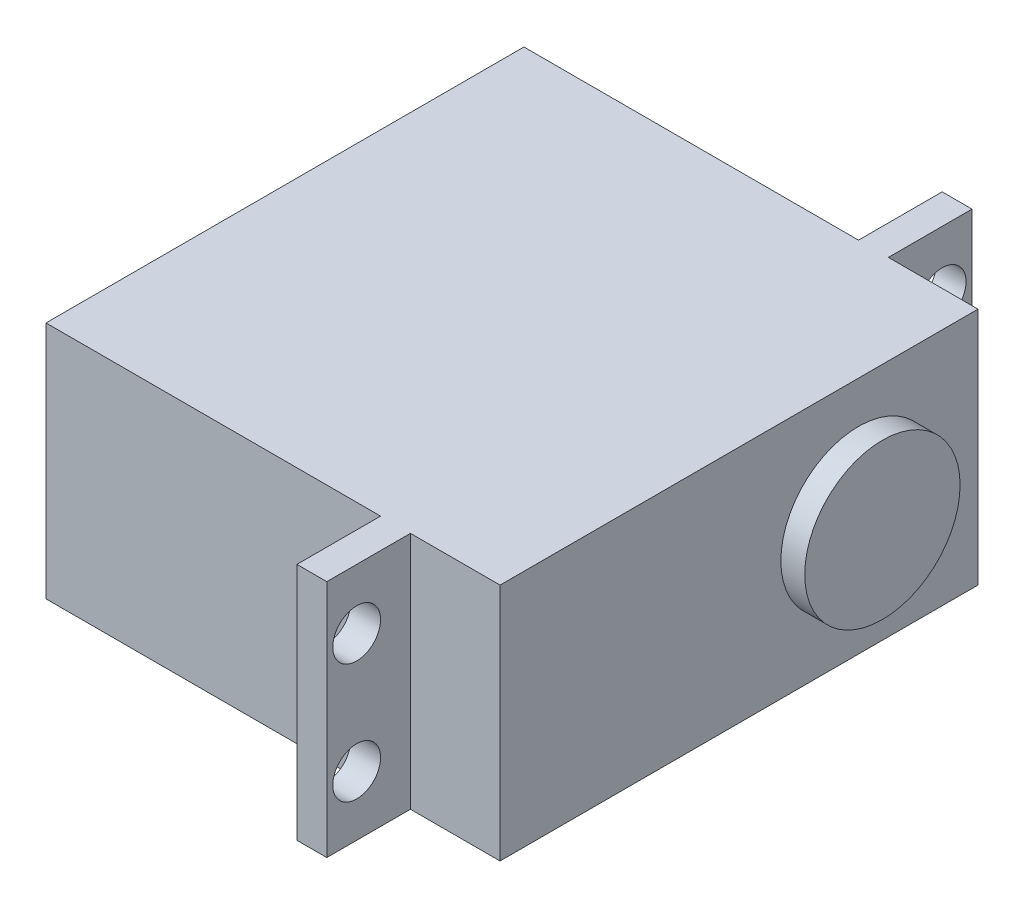
ISO-10303-21;
HEADER;
FILE_DESCRIPTION(('STEP AP214'),'2;1');
FILE_NAME('part.step','',(''),(''),'','','');
FILE_SCHEMA(('AUTOMOTIVE_DESIGN { 1 0 10303 214 1 1 1 1 }'));
ENDSEC;
DATA;
#1=APPLICATION_CONTEXT('core data for automotive mechanical design processes');
#2=APPLICATION_PROTOCOL_DEFINITION('international standard','automotive_design',2000,#1);
#3=PRODUCT_CONTEXT('',#1,'mechanical');
#4=PRODUCT('Part','Part','',(#3));
#5=PRODUCT_RELATED_PRODUCT_CATEGORY('part','',(#4));
#6=PRODUCT_DEFINITION_FORMATION('','',#4);
#7=PRODUCT_DEFINITION_CONTEXT('part definition',#1,'design');
#8=PRODUCT_DEFINITION('design','',#6,#7);
#9=PRODUCT_DEFINITION_SHAPE('','',#8);
#10=(LENGTH_UNIT() NAMED_UNIT(*) SI_UNIT(.MILLI.,.METRE.));
#11=(NAMED_UNIT(*) PLANE_ANGLE_UNIT() SI_UNIT($,.RADIAN.));
#12=(NAMED_UNIT(*) SI_UNIT($,.STERADIAN.) SOLID_ANGLE_UNIT());
#13=UNCERTAINTY_MEASURE_WITH_UNIT(LENGTH_MEASURE(1.E-05),#10,'distance_accuracy_value','');
#14=(GEOMETRIC_REPRESENTATION_CONTEXT(3) GLOBAL_UNCERTAINTY_ASSIGNED_CONTEXT((#13)) GLOBAL_UNIT_ASSIGNED_CONTEXT((#10,
#11,#12)) REPRESENTATION_CONTEXT('',''));
#15=CARTESIAN_POINT('',(0.,0.,0.));
#16=DIRECTION('',(0.,0.,1.));
#17=DIRECTION('',(1.,0.,0.));
#18=AXIS2_PLACEMENT_3D('',#15,#16,#17);
#19=CARTESIAN_POINT('',(19.,20.,-20.));
#20=DIRECTION('',(-1.,0.,0.));
#21=DIRECTION('',(0.,0.,1.));
#22=AXIS2_PLACEMENT_3D('',#19,#20,#21);
#23=PLANE('',#22);
#24=DIRECTION('',(0.,0.,-1.));
#25=VECTOR('',#24,1.);
#26=CARTESIAN_POINT('',(19.,0.,-20.));
#27=LINE('',#26,#25);
#28=CARTESIAN_POINT('',(19.,0.,20.));
#29=VERTEX_POINT('',#28);
#30=CARTESIAN_POINT('',(19.,0.,-20.));
#31=VERTEX_POINT('',#30);
#32=EDGE_CURVE('E158',#29,#31,#27,.T.);
#33=ORIENTED_EDGE('',*,*,#32,.T.);
#34=DIRECTION('',(0.,-1.,0.));
#35=VECTOR('',#34,1.);
#36=CARTESIAN_POINT('',(19.,20.,-20.));
#37=LINE('',#36,#35);
#38=CARTESIAN_POINT('',(19.,20.,-20.));
#39=VERTEX_POINT('',#38);
#40=EDGE_CURVE('E200',#39,#31,#37,.T.);
#41=ORIENTED_EDGE('',*,*,#40,.F.);
#42=DIRECTION('',(0.,0.,-1.));
#43=VECTOR('',#42,1.);
#44=CARTESIAN_POINT('',(19.,20.,-20.));
#45=LINE('',#44,#43);
#46=CARTESIAN_POINT('',(19.,20.,20.));
#47=VERTEX_POINT('',#46);
#48=EDGE_CURVE('E106',#47,#39,#45,.T.);
#49=ORIENTED_EDGE('',*,*,#48,.F.);
#50=DIRECTION('',(0.,-1.,0.));
#51=VECTOR('',#50,1.);
#52=CARTESIAN_POINT('',(19.,20.,20.));
#53=LINE('',#52,#51);
#54=EDGE_CURVE('E42',#47,#29,#53,.T.);
#55=ORIENTED_EDGE('',*,*,#54,.T.);
#56=EDGE_LOOP('',(#33,#41,#49,#55));
#57=FACE_BOUND('',#56,.T.);
#58=CARTESIAN_POINT('',(19.,10.,-10.));
#59=DIRECTION('',(-1.,0.,0.));
#60=DIRECTION('',(0.,0.,1.));
#61=AXIS2_PLACEMENT_3D('',#58,#59,#60);
#62=CIRCLE('',#61,6.5);
#63=CARTESIAN_POINT('',(19.,10.,-3.5));
#64=VERTEX_POINT('',#63);
#65=EDGE_CURVE('E11',#64,#64,#62,.F.);
#66=ORIENTED_EDGE('',*,*,#65,.F.);
#67=EDGE_LOOP('',(#66));
#68=FACE_BOUND('',#67,.T.);
#69=ADVANCED_FACE('F33',(#57,#68),#23,.F.);
#70=CARTESIAN_POINT('',(11.5,20.,20.));
#71=DIRECTION('',(0.,0.,-1.));
#72=DIRECTION('',(-1.,0.,0.));
#73=AXIS2_PLACEMENT_3D('',#70,#71,#72);
#74=PLANE('',#73);
#75=DIRECTION('',(1.,0.,0.));
#76=VECTOR('',#75,1.);
#77=CARTESIAN_POINT('',(11.5,0.,20.));
#78=LINE('',#77,#76);
#79=CARTESIAN_POINT('',(11.5,0.,20.));
#80=VERTEX_POINT('',#79);
#81=EDGE_CURVE('E155',#80,#29,#78,.T.);
#82=ORIENTED_EDGE('',*,*,#81,.T.);
#83=ORIENTED_EDGE('',*,*,#54,.F.);
#84=DIRECTION('',(1.,0.,0.));
#85=VECTOR('',#84,1.);
#86=CARTESIAN_POINT('',(11.5,20.,20.));
#87=LINE('',#86,#85);
#88=CARTESIAN_POINT('',(11.5,20.,20.));
#89=VERTEX_POINT('',#88);
#90=EDGE_CURVE('E178',#89,#47,#87,.T.);
#91=ORIENTED_EDGE('',*,*,#90,.F.);
#92=DIRECTION('',(0.,-1.,0.));
#93=VECTOR('',#92,1.);
#94=CARTESIAN_POINT('',(11.5,20.,20.));
#95=LINE('',#94,#93);
#96=EDGE_CURVE('E151',#89,#80,#95,.T.);
#97=ORIENTED_EDGE('',*,*,#96,.T.);
#98=EDGE_LOOP('',(#82,#83,#91,#97));
#99=FACE_BOUND('',#98,.T.);
#100=ADVANCED_FACE('F35',(#99),#74,.F.);
#101=CARTESIAN_POINT('',(11.5,20.,-20.));
#102=DIRECTION('',(0.,0.,1.));
#103=DIRECTION('',(1.,0.,0.));
#104=AXIS2_PLACEMENT_3D('',#101,#102,#103);
#105=PLANE('',#104);
#106=DIRECTION('',(-1.,0.,0.));
#107=VECTOR('',#106,1.);
#108=CARTESIAN_POINT('',(11.5,0.,-20.));
#109=LINE('',#108,#107);
#110=CARTESIAN_POINT('',(11.5,0.,-20.));
#111=VERTEX_POINT('',#110);
#112=EDGE_CURVE('E161',#31,#111,#109,.T.);
#113=ORIENTED_EDGE('',*,*,#112,.T.);
#114=DIRECTION('',(0.,-1.,0.));
#115=VECTOR('',#114,1.);
#116=CARTESIAN_POINT('',(11.5,20.,-20.));
#117=LINE('',#116,#115);
#118=CARTESIAN_POINT('',(11.5,20.,-20.));
#119=VERTEX_POINT('',#118);
#120=EDGE_CURVE('E197',#119,#111,#117,.T.);
#121=ORIENTED_EDGE('',*,*,#120,.F.);
#122=DIRECTION('',(-1.,0.,0.));
#123=VECTOR('',#122,1.);
#124=CARTESIAN_POINT('',(11.5,20.,-20.));
#125=LINE('',#124,#123);
#126=EDGE_CURVE('E223',#39,#119,#125,.T.);
#127=ORIENTED_EDGE('',*,*,#126,.F.);
#128=ORIENTED_EDGE('',*,*,#40,.T.);
#129=EDGE_LOOP('',(#113,#121,#127,#128));
#130=FACE_BOUND('',#129,.T.);
#131=ADVANCED_FACE('F214',(#130),#105,.F.);
#132=CARTESIAN_POINT('',(11.5,20.,-27.));
#133=DIRECTION('',(-1.,0.,0.));
#134=DIRECTION('',(0.,0.,1.));
#135=AXIS2_PLACEMENT_3D('',#132,#133,#134);
#136=PLANE('',#135);
#137=CARTESIAN_POINT('',(11.5,15.,-24.5));
#138=DIRECTION('',(1.,0.,0.));
#139=DIRECTION('',(0.,0.,-1.));
#140=AXIS2_PLACEMENT_3D('',#137,#138,#139);
#141=CIRCLE('',#140,2.00000000000001);
#142=CARTESIAN_POINT('',(11.5,15.,-26.5));
#143=VERTEX_POINT('',#142);
#144=EDGE_CURVE('E427',#143,#143,#141,.T.);
#145=ORIENTED_EDGE('',*,*,#144,.F.);
#146=EDGE_LOOP('',(#145));
#147=FACE_BOUND('',#146,.T.);
#148=CARTESIAN_POINT('',(11.5,5.,-24.5));
#149=DIRECTION('',(1.,0.,0.));
#150=DIRECTION('',(0.,0.,-1.));
#151=AXIS2_PLACEMENT_3D('',#148,#149,#150);
#152=CIRCLE('',#151,2.);
#153=CARTESIAN_POINT('',(11.5,5.,-26.5));
#154=VERTEX_POINT('',#153);
#155=EDGE_CURVE('E435',#154,#154,#152,.T.);
#156=ORIENTED_EDGE('',*,*,#155,.F.);
#157=EDGE_LOOP('',(#156));
#158=FACE_BOUND('',#157,.T.);
#159=DIRECTION('',(0.,0.,-1.));
#160=VECTOR('',#159,1.);
#161=CARTESIAN_POINT('',(11.5,0.,-27.));
#162=LINE('',#161,#160);
#163=CARTESIAN_POINT('',(11.5,0.,-27.));
#164=VERTEX_POINT('',#163);
#165=EDGE_CURVE('E163',#111,#164,#162,.T.);
#166=ORIENTED_EDGE('',*,*,#165,.T.);
#167=DIRECTION('',(0.,-1.,0.));
#168=VECTOR('',#167,1.);
#169=CARTESIAN_POINT('',(11.5,20.,-27.));
#170=LINE('',#169,#168);
#171=CARTESIAN_POINT('',(11.5,20.,-27.));
#172=VERTEX_POINT('',#171);
#173=EDGE_CURVE('E194',#172,#164,#170,.T.);
#174=ORIENTED_EDGE('',*,*,#173,.F.);
#175=DIRECTION('',(0.,0.,-1.));
#176=VECTOR('',#175,1.);
#177=CARTESIAN_POINT('',(11.5,20.,-27.));
#178=LINE('',#177,#176);
#179=EDGE_CURVE('E220',#119,#172,#178,.T.);
#180=ORIENTED_EDGE('',*,*,#179,.F.);
#181=ORIENTED_EDGE('',*,*,#120,.T.);
#182=EDGE_LOOP('',(#166,#174,#180,#181));
#183=FACE_BOUND('',#182,.T.);
#184=ADVANCED_FACE('F218',(#147,#158,#183),#136,.F.);
#185=CARTESIAN_POINT('',(9.,20.,-27.));
#186=DIRECTION('',(0.,0.,1.));
#187=DIRECTION('',(1.,0.,0.));
#188=AXIS2_PLACEMENT_3D('',#185,#186,#187);
#189=PLANE('',#188);
#190=DIRECTION('',(-1.,0.,0.));
#191=VECTOR('',#190,1.);
#192=CARTESIAN_POINT('',(9.,0.,-27.));
#193=LINE('',#192,#191);
#194=CARTESIAN_POINT('',(9.,0.,-27.));
#195=VERTEX_POINT('',#194);
#196=EDGE_CURVE('E165',#164,#195,#193,.T.);
#197=ORIENTED_EDGE('',*,*,#196,.T.);
#198=DIRECTION('',(0.,-1.,0.));
#199=VECTOR('',#198,1.);
#200=CARTESIAN_POINT('',(9.,20.,-27.));
#201=LINE('',#200,#199);
#202=CARTESIAN_POINT('',(9.,20.,-27.));
#203=VERTEX_POINT('',#202);
#204=EDGE_CURVE('E191',#203,#195,#201,.T.);
#205=ORIENTED_EDGE('',*,*,#204,.F.);
#206=DIRECTION('',(-1.,0.,0.));
#207=VECTOR('',#206,1.);
#208=CARTESIAN_POINT('',(9.,20.,-27.));
#209=LINE('',#208,#207);
#210=EDGE_CURVE('E222',#172,#203,#209,.T.);
#211=ORIENTED_EDGE('',*,*,#210,.F.);
#212=ORIENTED_EDGE('',*,*,#173,.T.);
#213=EDGE_LOOP('',(#197,#205,#211,#212));
#214=FACE_BOUND('',#213,.T.);
#215=ADVANCED_FACE('F254',(#214),#189,.F.);
#216=CARTESIAN_POINT('',(9.,20.,-27.));
#217=DIRECTION('',(1.,0.,0.));
#218=DIRECTION('',(0.,0.,-1.));
#219=AXIS2_PLACEMENT_3D('',#216,#217,#218);
#220=PLANE('',#219);
#221=CARTESIAN_POINT('',(9.00000000000001,15.,-24.5));
#222=DIRECTION('',(1.,0.,0.));
#223=DIRECTION('',(0.,0.,-1.));
#224=AXIS2_PLACEMENT_3D('',#221,#222,#223);
#225=CIRCLE('',#224,2.00000000000001);
#226=CARTESIAN_POINT('',(9.00000000000001,15.,-26.5));
#227=VERTEX_POINT('',#226);
#228=EDGE_CURVE('E430',#227,#227,#225,.F.);
#229=ORIENTED_EDGE('',*,*,#228,.F.);
#230=EDGE_LOOP('',(#229));
#231=FACE_BOUND('',#230,.T.);
#232=CARTESIAN_POINT('',(9.00000000000001,5.,-24.5));
#233=DIRECTION('',(1.,0.,0.));
#234=DIRECTION('',(0.,0.,-1.));
#235=AXIS2_PLACEMENT_3D('',#232,#233,#234);
#236=CIRCLE('',#235,2.);
#237=CARTESIAN_POINT('',(9.00000000000001,5.,-26.5));
#238=VERTEX_POINT('',#237);
#239=EDGE_CURVE('E438',#238,#238,#236,.F.);
#240=ORIENTED_EDGE('',*,*,#239,.F.);
#241=EDGE_LOOP('',(#240));
#242=FACE_BOUND('',#241,.T.);
#243=DIRECTION('',(0.,0.,1.));
#244=VECTOR('',#243,1.);
#245=CARTESIAN_POINT('',(9.,0.,-27.));
#246=LINE('',#245,#244);
#247=CARTESIAN_POINT('',(9.,0.,-20.));
#248=VERTEX_POINT('',#247);
#249=EDGE_CURVE('E167',#195,#248,#246,.T.);
#250=ORIENTED_EDGE('',*,*,#249,.T.);
#251=DIRECTION('',(0.,-1.,0.));
#252=VECTOR('',#251,1.);
#253=CARTESIAN_POINT('',(9.,20.,-20.));
#254=LINE('',#253,#252);
#255=CARTESIAN_POINT('',(9.,20.,-20.));
#256=VERTEX_POINT('',#255);
#257=EDGE_CURVE('E188',#256,#248,#254,.T.);
#258=ORIENTED_EDGE('',*,*,#257,.F.);
#259=DIRECTION('',(0.,0.,1.));
#260=VECTOR('',#259,1.);
#261=CARTESIAN_POINT('',(9.,20.,-27.));
#262=LINE('',#261,#260);
#263=EDGE_CURVE('E225',#203,#256,#262,.T.);
#264=ORIENTED_EDGE('',*,*,#263,.F.);
#265=ORIENTED_EDGE('',*,*,#204,.T.);
#266=EDGE_LOOP('',(#250,#258,#264,#265));
#267=FACE_BOUND('',#266,.T.);
#268=ADVANCED_FACE('F251',(#231,#242,#267),#220,.F.);
#269=CARTESIAN_POINT('',(-19.,20.,-20.));
#270=DIRECTION('',(0.,0.,1.));
#271=DIRECTION('',(1.,0.,0.));
#272=AXIS2_PLACEMENT_3D('',#269,#270,#271);
#273=PLANE('',#272);
#274=DIRECTION('',(-1.,0.,0.));
#275=VECTOR('',#274,1.);
#276=CARTESIAN_POINT('',(-19.,0.,-20.));
#277=LINE('',#276,#275);
#278=CARTESIAN_POINT('',(-19.,0.,-20.));
#279=VERTEX_POINT('',#278);
#280=EDGE_CURVE('E169',#248,#279,#277,.T.);
#281=ORIENTED_EDGE('',*,*,#280,.T.);
#282=DIRECTION('',(0.,-1.,0.));
#283=VECTOR('',#282,1.);
#284=CARTESIAN_POINT('',(-19.,20.,-20.));
#285=LINE('',#284,#283);
#286=CARTESIAN_POINT('',(-19.,20.,-20.));
#287=VERTEX_POINT('',#286);
#288=EDGE_CURVE('E185',#287,#279,#285,.T.);
#289=ORIENTED_EDGE('',*,*,#288,.F.);
#290=DIRECTION('',(-1.,0.,0.));
#291=VECTOR('',#290,1.);
#292=CARTESIAN_POINT('',(-19.,20.,-20.));
#293=LINE('',#292,#291);
#294=EDGE_CURVE('E231',#256,#287,#293,.T.);
#295=ORIENTED_EDGE('',*,*,#294,.F.);
#296=ORIENTED_EDGE('',*,*,#257,.T.);
#297=EDGE_LOOP('',(#281,#289,#295,#296));
#298=FACE_BOUND('',#297,.T.);
#299=ADVANCED_FACE('F247',(#298),#273,.F.);
#300=CARTESIAN_POINT('',(-19.,20.,-20.));
#301=DIRECTION('',(1.,0.,0.));
#302=DIRECTION('',(0.,0.,-1.));
#303=AXIS2_PLACEMENT_3D('',#300,#301,#302);
#304=PLANE('',#303);
#305=DIRECTION('',(0.,0.,1.));
#306=VECTOR('',#305,1.);
#307=CARTESIAN_POINT('',(-19.,0.,-20.));
#308=LINE('',#307,#306);
#309=CARTESIAN_POINT('',(-19.,0.,20.));
#310=VERTEX_POINT('',#309);
#311=EDGE_CURVE('E171',#279,#310,#308,.T.);
#312=ORIENTED_EDGE('',*,*,#311,.T.);
#313=DIRECTION('',(0.,-1.,0.));
#314=VECTOR('',#313,1.);
#315=CARTESIAN_POINT('',(-19.,20.,20.));
#316=LINE('',#315,#314);
#317=CARTESIAN_POINT('',(-19.,20.,20.));
#318=VERTEX_POINT('',#317);
#319=EDGE_CURVE('E182',#318,#310,#316,.T.);
#320=ORIENTED_EDGE('',*,*,#319,.F.);
#321=DIRECTION('',(0.,0.,1.));
#322=VECTOR('',#321,1.);
#323=CARTESIAN_POINT('',(-19.,20.,-20.));
#324=LINE('',#323,#322);
#325=EDGE_CURVE('E233',#287,#318,#324,.T.);
#326=ORIENTED_EDGE('',*,*,#325,.F.);
#327=ORIENTED_EDGE('',*,*,#288,.T.);
#328=EDGE_LOOP('',(#312,#320,#326,#327));
#329=FACE_BOUND('',#328,.T.);
#330=ADVANCED_FACE('F239',(#329),#304,.F.);
#331=CARTESIAN_POINT('',(-19.,20.,20.));
#332=DIRECTION('',(0.,0.,-1.));
#333=DIRECTION('',(-1.,0.,0.));
#334=AXIS2_PLACEMENT_3D('',#331,#332,#333);
#335=PLANE('',#334);
#336=DIRECTION('',(1.,0.,0.));
#337=VECTOR('',#336,1.);
#338=CARTESIAN_POINT('',(-19.,0.,20.));
#339=LINE('',#338,#337);
#340=CARTESIAN_POINT('',(9.00000000000001,0.,20.));
#341=VERTEX_POINT('',#340);
#342=EDGE_CURVE('E173',#310,#341,#339,.T.);
#343=ORIENTED_EDGE('',*,*,#342,.T.);
#344=DIRECTION('',(0.,-1.,0.));
#345=VECTOR('',#344,1.);
#346=CARTESIAN_POINT('',(9.00000000000001,20.,20.));
#347=LINE('',#346,#345);
#348=CARTESIAN_POINT('',(9.00000000000001,20.,20.));
#349=VERTEX_POINT('',#348);
#350=EDGE_CURVE('E146',#349,#341,#347,.T.);
#351=ORIENTED_EDGE('',*,*,#350,.F.);
#352=DIRECTION('',(1.,0.,0.));
#353=VECTOR('',#352,1.);
#354=CARTESIAN_POINT('',(-19.,20.,20.));
#355=LINE('',#354,#353);
#356=EDGE_CURVE('E137',#318,#349,#355,.T.);
#357=ORIENTED_EDGE('',*,*,#356,.F.);
#358=ORIENTED_EDGE('',*,*,#319,.T.);
#359=EDGE_LOOP('',(#343,#351,#357,#358));
#360=FACE_BOUND('',#359,.T.);
#361=ADVANCED_FACE('F243',(#360),#335,.F.);
#362=CARTESIAN_POINT('',(9.00000000000001,20.,27.));
#363=DIRECTION('',(1.,0.,0.));
#364=DIRECTION('',(0.,0.,-1.));
#365=AXIS2_PLACEMENT_3D('',#362,#363,#364);
#366=PLANE('',#365);
#367=CARTESIAN_POINT('',(9.00000000000001,5.,24.5));
#368=DIRECTION('',(1.,0.,0.));
#369=DIRECTION('',(0.,0.,-1.));
#370=AXIS2_PLACEMENT_3D('',#367,#368,#369);
#371=CIRCLE('',#370,2.);
#372=CARTESIAN_POINT('',(9.00000000000001,5.,22.5));
#373=VERTEX_POINT('',#372);
#374=EDGE_CURVE('E444',#373,#373,#371,.F.);
#375=ORIENTED_EDGE('',*,*,#374,.F.);
#376=EDGE_LOOP('',(#375));
#377=FACE_BOUND('',#376,.T.);
#378=CARTESIAN_POINT('',(9.00000000000001,15.,24.5));
#379=DIRECTION('',(1.,0.,0.));
#380=DIRECTION('',(0.,0.,-1.));
#381=AXIS2_PLACEMENT_3D('',#378,#379,#380);
#382=CIRCLE('',#381,2.00000000000001);
#383=CARTESIAN_POINT('',(9.00000000000001,15.,22.5));
#384=VERTEX_POINT('',#383);
#385=EDGE_CURVE('E159',#384,#384,#382,.F.);
#386=ORIENTED_EDGE('',*,*,#385,.F.);
#387=EDGE_LOOP('',(#386));
#388=FACE_BOUND('',#387,.T.);
#389=DIRECTION('',(0.,0.,1.));
#390=VECTOR('',#389,1.);
#391=CARTESIAN_POINT('',(9.00000000000001,0.,27.));
#392=LINE('',#391,#390);
#393=CARTESIAN_POINT('',(9.00000000000001,0.,27.));
#394=VERTEX_POINT('',#393);
#395=EDGE_CURVE('E145',#341,#394,#392,.T.);
#396=ORIENTED_EDGE('',*,*,#395,.T.);
#397=DIRECTION('',(0.,-1.,0.));
#398=VECTOR('',#397,1.);
#399=CARTESIAN_POINT('',(9.00000000000001,20.,27.));
#400=LINE('',#399,#398);
#401=CARTESIAN_POINT('',(9.00000000000001,20.,27.));
#402=VERTEX_POINT('',#401);
#403=EDGE_CURVE('E142',#402,#394,#400,.T.);
#404=ORIENTED_EDGE('',*,*,#403,.F.);
#405=DIRECTION('',(0.,0.,1.));
#406=VECTOR('',#405,1.);
#407=CARTESIAN_POINT('',(9.00000000000001,20.,27.));
#408=LINE('',#407,#406);
#409=EDGE_CURVE('E131',#349,#402,#408,.T.);
#410=ORIENTED_EDGE('',*,*,#409,.F.);
#411=ORIENTED_EDGE('',*,*,#350,.T.);
#412=EDGE_LOOP('',(#396,#404,#410,#411));
#413=FACE_BOUND('',#412,.T.);
#414=ADVANCED_FACE('F143',(#377,#388,#413),#366,.F.);
#415=CARTESIAN_POINT('',(9.00000000000001,20.,27.));
#416=DIRECTION('',(0.,0.,-1.));
#417=DIRECTION('',(-1.,0.,0.));
#418=AXIS2_PLACEMENT_3D('',#415,#416,#417);
#419=PLANE('',#418);
#420=DIRECTION('',(1.,0.,0.));
#421=VECTOR('',#420,1.);
#422=CARTESIAN_POINT('',(9.00000000000001,0.,27.));
#423=LINE('',#422,#421);
#424=CARTESIAN_POINT('',(11.5,0.,27.));
#425=VERTEX_POINT('',#424);
#426=EDGE_CURVE('E91',#394,#425,#423,.T.);
#427=ORIENTED_EDGE('',*,*,#426,.T.);
#428=DIRECTION('',(0.,-1.,0.));
#429=VECTOR('',#428,1.);
#430=CARTESIAN_POINT('',(11.5,20.,27.));
#431=LINE('',#430,#429);
#432=CARTESIAN_POINT('',(11.5,20.,27.));
#433=VERTEX_POINT('',#432);
#434=EDGE_CURVE('E147',#433,#425,#431,.T.);
#435=ORIENTED_EDGE('',*,*,#434,.F.);
#436=DIRECTION('',(1.,0.,0.));
#437=VECTOR('',#436,1.);
#438=CARTESIAN_POINT('',(9.00000000000001,20.,27.));
#439=LINE('',#438,#437);
#440=EDGE_CURVE('E135',#402,#433,#439,.T.);
#441=ORIENTED_EDGE('',*,*,#440,.F.);
#442=ORIENTED_EDGE('',*,*,#403,.T.);
#443=EDGE_LOOP('',(#427,#435,#441,#442));
#444=FACE_BOUND('',#443,.T.);
#445=ADVANCED_FACE('F149',(#444),#419,.F.);
#446=CARTESIAN_POINT('',(11.5,20.,27.));
#447=DIRECTION('',(-1.,0.,0.));
#448=DIRECTION('',(0.,0.,1.));
#449=AXIS2_PLACEMENT_3D('',#446,#447,#448);
#450=PLANE('',#449);
#451=CARTESIAN_POINT('',(11.5,5.,24.5));
#452=DIRECTION('',(1.,0.,0.));
#453=DIRECTION('',(0.,0.,-1.));
#454=AXIS2_PLACEMENT_3D('',#451,#452,#453);
#455=CIRCLE('',#454,2.);
#456=CARTESIAN_POINT('',(11.5,5.,22.5));
#457=VERTEX_POINT('',#456);
#458=EDGE_CURVE('E441',#457,#457,#455,.T.);
#459=ORIENTED_EDGE('',*,*,#458,.F.);
#460=EDGE_LOOP('',(#459));
#461=FACE_BOUND('',#460,.T.);
#462=CARTESIAN_POINT('',(11.5,15.,24.5));
#463=DIRECTION('',(1.,0.,0.));
#464=DIRECTION('',(0.,0.,-1.));
#465=AXIS2_PLACEMENT_3D('',#462,#463,#464);
#466=CIRCLE('',#465,2.00000000000001);
#467=CARTESIAN_POINT('',(11.5,15.,22.5));
#468=VERTEX_POINT('',#467);
#469=EDGE_CURVE('E447',#468,#468,#466,.T.);
#470=ORIENTED_EDGE('',*,*,#469,.F.);
#471=EDGE_LOOP('',(#470));
#472=FACE_BOUND('',#471,.T.);
#473=DIRECTION('',(0.,0.,-1.));
#474=VECTOR('',#473,1.);
#475=CARTESIAN_POINT('',(11.5,0.,27.));
#476=LINE('',#475,#474);
#477=EDGE_CURVE('E97',#425,#80,#476,.T.);
#478=ORIENTED_EDGE('',*,*,#477,.T.);
#479=ORIENTED_EDGE('',*,*,#96,.F.);
#480=DIRECTION('',(0.,0.,-1.));
#481=VECTOR('',#480,1.);
#482=CARTESIAN_POINT('',(11.5,20.,27.));
#483=LINE('',#482,#481);
#484=EDGE_CURVE('E50',#433,#89,#483,.T.);
#485=ORIENTED_EDGE('',*,*,#484,.F.);
#486=ORIENTED_EDGE('',*,*,#434,.T.);
#487=EDGE_LOOP('',(#478,#479,#485,#486));
#488=FACE_BOUND('',#487,.T.);
#489=ADVANCED_FACE('F311',(#461,#472,#488),#450,.F.);
#490=CARTESIAN_POINT('',(0.,20.,0.));
#491=DIRECTION('',(0.,-1.,0.));
#492=DIRECTION('',(0.,0.,-1.));
#493=AXIS2_PLACEMENT_3D('',#490,#491,#492);
#494=PLANE('',#493);
#495=ORIENTED_EDGE('',*,*,#90,.T.);
#496=ORIENTED_EDGE('',*,*,#48,.T.);
#497=ORIENTED_EDGE('',*,*,#126,.T.);
#498=ORIENTED_EDGE('',*,*,#179,.T.);
#499=ORIENTED_EDGE('',*,*,#210,.T.);
#500=ORIENTED_EDGE('',*,*,#263,.T.);
#501=ORIENTED_EDGE('',*,*,#294,.T.);
#502=ORIENTED_EDGE('',*,*,#325,.T.);
#503=ORIENTED_EDGE('',*,*,#356,.T.);
#504=ORIENTED_EDGE('',*,*,#409,.T.);
#505=ORIENTED_EDGE('',*,*,#440,.T.);
#506=ORIENTED_EDGE('',*,*,#484,.T.);
#507=EDGE_LOOP('',(#495,#496,#497,#498,#499,#500,#501,#502,#503,#504,#505,#506));
#508=FACE_BOUND('',#507,.T.);
#509=ADVANCED_FACE('F133',(#508),#494,.F.);
#510=CARTESIAN_POINT('',(0.,0.,0.));
#511=DIRECTION('',(0.,-1.,0.));
#512=DIRECTION('',(0.,0.,-1.));
#513=AXIS2_PLACEMENT_3D('',#510,#511,#512);
#514=PLANE('',#513);
#515=ORIENTED_EDGE('',*,*,#81,.F.);
#516=ORIENTED_EDGE('',*,*,#477,.F.);
#517=ORIENTED_EDGE('',*,*,#426,.F.);
#518=ORIENTED_EDGE('',*,*,#395,.F.);
#519=ORIENTED_EDGE('',*,*,#342,.F.);
#520=ORIENTED_EDGE('',*,*,#311,.F.);
#521=ORIENTED_EDGE('',*,*,#280,.F.);
#522=ORIENTED_EDGE('',*,*,#249,.F.);
#523=ORIENTED_EDGE('',*,*,#196,.F.);
#524=ORIENTED_EDGE('',*,*,#165,.F.);
#525=ORIENTED_EDGE('',*,*,#112,.F.);
#526=ORIENTED_EDGE('',*,*,#32,.F.);
#527=EDGE_LOOP('',(#515,#516,#517,#518,#519,#520,#521,#522,#523,#524,#525,#526));
#528=FACE_BOUND('',#527,.T.);
#529=ADVANCED_FACE('F208',(#528),#514,.T.);
#530=CARTESIAN_POINT('',(3.34314575050761,15.,24.5));
#531=DIRECTION('',(1.,0.,0.));
#532=DIRECTION('',(0.,0.,-1.));
#533=AXIS2_PLACEMENT_3D('',#530,#531,#532);
#534=CYLINDRICAL_SURFACE('',#533,2.00000000000001);
#535=ORIENTED_EDGE('',*,*,#385,.T.);
#536=EDGE_LOOP('',(#535));
#537=FACE_BOUND('',#536,.T.);
#538=ORIENTED_EDGE('',*,*,#469,.T.);
#539=EDGE_LOOP('',(#538));
#540=FACE_BOUND('',#539,.T.);
#541=ADVANCED_FACE('F323',(#537,#540),#534,.F.);
#542=CARTESIAN_POINT('',(3.34314575050761,5.,24.5));
#543=DIRECTION('',(1.,0.,0.));
#544=DIRECTION('',(0.,0.,-1.));
#545=AXIS2_PLACEMENT_3D('',#542,#543,#544);
#546=CYLINDRICAL_SURFACE('',#545,2.);
#547=ORIENTED_EDGE('',*,*,#374,.T.);
#548=EDGE_LOOP('',(#547));
#549=FACE_BOUND('',#548,.T.);
#550=ORIENTED_EDGE('',*,*,#458,.T.);
#551=EDGE_LOOP('',(#550));
#552=FACE_BOUND('',#551,.T.);
#553=ADVANCED_FACE('F328',(#549,#552),#546,.F.);
#554=CARTESIAN_POINT('',(3.34314575050761,5.,-24.5));
#555=DIRECTION('',(1.,0.,0.));
#556=DIRECTION('',(0.,0.,-1.));
#557=AXIS2_PLACEMENT_3D('',#554,#555,#556);
#558=CYLINDRICAL_SURFACE('',#557,2.);
#559=ORIENTED_EDGE('',*,*,#239,.T.);
#560=EDGE_LOOP('',(#559));
#561=FACE_BOUND('',#560,.T.);
#562=ORIENTED_EDGE('',*,*,#155,.T.);
#563=EDGE_LOOP('',(#562));
#564=FACE_BOUND('',#563,.T.);
#565=ADVANCED_FACE('F338',(#561,#564),#558,.F.);
#566=CARTESIAN_POINT('',(3.34314575050761,15.,-24.5));
#567=DIRECTION('',(1.,0.,0.));
#568=DIRECTION('',(0.,0.,-1.));
#569=AXIS2_PLACEMENT_3D('',#566,#567,#568);
#570=CYLINDRICAL_SURFACE('',#569,2.00000000000001);
#571=ORIENTED_EDGE('',*,*,#228,.T.);
#572=EDGE_LOOP('',(#571));
#573=FACE_BOUND('',#572,.T.);
#574=ORIENTED_EDGE('',*,*,#144,.T.);
#575=EDGE_LOOP('',(#574));
#576=FACE_BOUND('',#575,.T.);
#577=ADVANCED_FACE('F348',(#573,#576),#570,.F.);
#578=CARTESIAN_POINT('',(21.,10.,-10.));
#579=DIRECTION('',(-1.,0.,0.));
#580=DIRECTION('',(0.,0.,1.));
#581=AXIS2_PLACEMENT_3D('',#578,#579,#580);
#582=CYLINDRICAL_SURFACE('',#581,6.5);
#583=CARTESIAN_POINT('',(21.,10.,-10.));
#584=DIRECTION('',(1.,0.,0.));
#585=DIRECTION('',(0.,0.,-1.));
#586=AXIS2_PLACEMENT_3D('',#583,#584,#585);
#587=CIRCLE('',#586,6.5);
#588=CARTESIAN_POINT('',(21.,10.,-16.5));
#589=VERTEX_POINT('',#588);
#590=EDGE_CURVE('E426',#589,#589,#587,.T.);
#591=ORIENTED_EDGE('',*,*,#590,.F.);
#592=EDGE_LOOP('',(#591));
#593=FACE_BOUND('',#592,.T.);
#594=ORIENTED_EDGE('',*,*,#65,.T.);
#595=EDGE_LOOP('',(#594));
#596=FACE_BOUND('',#595,.T.);
#597=ADVANCED_FACE('F357',(#593,#596),#582,.T.);
#598=CARTESIAN_POINT('',(21.,10.,-10.));
#599=DIRECTION('',(1.,0.,0.));
#600=DIRECTION('',(0.,0.,-1.));
#601=AXIS2_PLACEMENT_3D('',#598,#599,#600);
#602=PLANE('',#601);
#603=ORIENTED_EDGE('',*,*,#590,.T.);
#604=EDGE_LOOP('',(#603));
#605=FACE_BOUND('',#604,.T.);
#606=ADVANCED_FACE('F372',(#605),#602,.T.);
#607=CLOSED_SHELL('',(#69,#100,#131,#184,#215,#268,#299,#330,#361,#414,#445,#489,#509,#529,#541,
#553,#565,#577,#597,#606));
#608=MANIFOLD_SOLID_BREP('B2',#607);
#609=ADVANCED_BREP_SHAPE_REPRESENTATION('',(#18,#608),#14);
#610=SHAPE_DEFINITION_REPRESENTATION(#9,#609);
ENDSEC;
END-ISO-10303-21;
